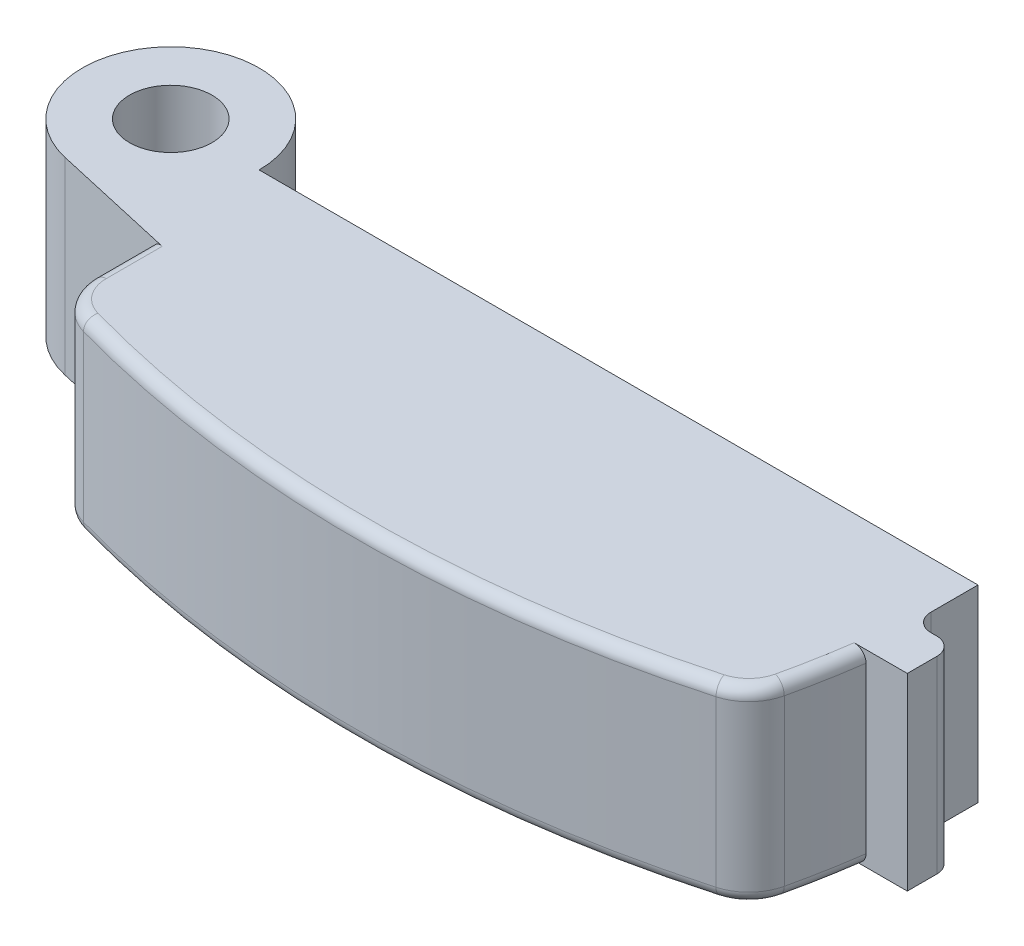
ISO-10303-21;
HEADER;
FILE_DESCRIPTION(('STEP AP214'),'2;1');
FILE_NAME('part.step','',(''),(''),'','','');
FILE_SCHEMA(('AUTOMOTIVE_DESIGN { 1 0 10303 214 1 1 1 1 }'));
ENDSEC;
DATA;
#1=APPLICATION_CONTEXT('core data for automotive mechanical design processes');
#2=APPLICATION_PROTOCOL_DEFINITION('international standard','automotive_design',2000,#1);
#3=PRODUCT_CONTEXT('',#1,'mechanical');
#4=PRODUCT('Part','Part','',(#3));
#5=PRODUCT_RELATED_PRODUCT_CATEGORY('part','',(#4));
#6=PRODUCT_DEFINITION_FORMATION('','',#4);
#7=PRODUCT_DEFINITION_CONTEXT('part definition',#1,'design');
#8=PRODUCT_DEFINITION('design','',#6,#7);
#9=PRODUCT_DEFINITION_SHAPE('','',#8);
#10=(LENGTH_UNIT() NAMED_UNIT(*) SI_UNIT(.MILLI.,.METRE.));
#11=(NAMED_UNIT(*) PLANE_ANGLE_UNIT() SI_UNIT($,.RADIAN.));
#12=(NAMED_UNIT(*) SI_UNIT($,.STERADIAN.) SOLID_ANGLE_UNIT());
#13=UNCERTAINTY_MEASURE_WITH_UNIT(LENGTH_MEASURE(1.E-05),#10,'distance_accuracy_value','');
#14=(GEOMETRIC_REPRESENTATION_CONTEXT(3) GLOBAL_UNCERTAINTY_ASSIGNED_CONTEXT((#13)) GLOBAL_UNIT_ASSIGNED_CONTEXT((#10,
#11,#12)) REPRESENTATION_CONTEXT('',''));
#15=CARTESIAN_POINT('',(0.,0.,0.));
#16=DIRECTION('',(0.,0.,1.));
#17=DIRECTION('',(1.,0.,0.));
#18=AXIS2_PLACEMENT_3D('',#15,#16,#17);
#19=CARTESIAN_POINT('',(34.25,-4.,0.));
#20=DIRECTION('',(1.,0.,0.));
#21=DIRECTION('',(0.,0.,-1.));
#22=AXIS2_PLACEMENT_3D('',#19,#20,#21);
#23=PLANE('',#22);
#24=DIRECTION('',(0.,0.,-1.));
#25=VECTOR('',#24,1.);
#26=CARTESIAN_POINT('',(34.25,4.,0.));
#27=LINE('',#26,#25);
#28=CARTESIAN_POINT('',(34.25,4.,2.));
#29=VERTEX_POINT('',#28);
#30=CARTESIAN_POINT('',(34.25,4.,0.));
#31=VERTEX_POINT('',#30);
#32=EDGE_CURVE('E262',#29,#31,#27,.T.);
#33=ORIENTED_EDGE('',*,*,#32,.F.);
#34=DIRECTION('',(0.,-1.,0.));
#35=VECTOR('',#34,1.);
#36=CARTESIAN_POINT('',(34.25,-4.,2.));
#37=LINE('',#36,#35);
#38=CARTESIAN_POINT('',(34.25,-4.,2.));
#39=VERTEX_POINT('',#38);
#40=EDGE_CURVE('E389',#29,#39,#37,.T.);
#41=ORIENTED_EDGE('',*,*,#40,.T.);
#42=DIRECTION('',(0.,0.,-1.));
#43=VECTOR('',#42,1.);
#44=CARTESIAN_POINT('',(34.25,-4.,0.));
#45=LINE('',#44,#43);
#46=CARTESIAN_POINT('',(34.25,-4.,0.));
#47=VERTEX_POINT('',#46);
#48=EDGE_CURVE('E265',#39,#47,#45,.T.);
#49=ORIENTED_EDGE('',*,*,#48,.T.);
#50=DIRECTION('',(0.,1.,0.));
#51=VECTOR('',#50,1.);
#52=CARTESIAN_POINT('',(34.25,-4.,0.));
#53=LINE('',#52,#51);
#54=EDGE_CURVE('E276',#47,#31,#53,.T.);
#55=ORIENTED_EDGE('',*,*,#54,.T.);
#56=EDGE_LOOP('',(#33,#41,#49,#55));
#57=FACE_BOUND('',#56,.T.);
#58=ADVANCED_FACE('F35',(#57),#23,.T.);
#59=CARTESIAN_POINT('',(0.,-4.,0.));
#60=DIRECTION('',(0.,1.,0.));
#61=DIRECTION('',(0.,0.,1.));
#62=AXIS2_PLACEMENT_3D('',#59,#60,#61);
#63=CYLINDRICAL_SURFACE('',#62,34.5778108040402);
#64=DIRECTION('',(0.,1.,0.));
#65=VECTOR('',#64,1.);
#66=CARTESIAN_POINT('',(34.25,-4.,4.75));
#67=LINE('',#66,#65);
#68=CARTESIAN_POINT('',(34.25,-3.5,4.75));
#69=VERTEX_POINT('',#68);
#70=CARTESIAN_POINT('',(34.25,3.5,4.75));
#71=VERTEX_POINT('',#70);
#72=EDGE_CURVE('E285',#69,#71,#67,.T.);
#73=ORIENTED_EDGE('',*,*,#72,.T.);
#74=CARTESIAN_POINT('',(0.,3.5,0.));
#75=DIRECTION('',(0.,-1.,0.));
#76=DIRECTION('',(0.,0.,-1.));
#77=AXIS2_PLACEMENT_3D('',#74,#75,#76);
#78=CIRCLE('',#77,34.5778108040402);
#79=CARTESIAN_POINT('',(33.7133062471766,3.5,7.68361776014925));
#80=VERTEX_POINT('',#79);
#81=EDGE_CURVE('E332',#71,#80,#78,.T.);
#82=ORIENTED_EDGE('',*,*,#81,.T.);
#83=DIRECTION('',(0.,1.,0.));
#84=VECTOR('',#83,1.);
#85=CARTESIAN_POINT('',(33.7133062471766,-4.,7.68361776014925));
#86=LINE('',#85,#84);
#87=CARTESIAN_POINT('',(33.7133062471766,-3.5,7.68361776014925));
#88=VERTEX_POINT('',#87);
#89=EDGE_CURVE('E289',#88,#80,#86,.T.);
#90=ORIENTED_EDGE('',*,*,#89,.F.);
#91=CARTESIAN_POINT('',(0.,-3.5,0.));
#92=DIRECTION('',(0.,-1.,0.));
#93=DIRECTION('',(0.,0.,-1.));
#94=AXIS2_PLACEMENT_3D('',#91,#92,#93);
#95=CIRCLE('',#94,34.5778108040402);
#96=EDGE_CURVE('E330',#88,#69,#95,.F.);
#97=ORIENTED_EDGE('',*,*,#96,.T.);
#98=EDGE_LOOP('',(#73,#82,#90,#97));
#99=FACE_BOUND('',#98,.T.);
#100=ADVANCED_FACE('F410',(#99),#63,.T.);
#101=CARTESIAN_POINT('',(31.7633096763563,-4.,7.23919299285014));
#102=DIRECTION('',(0.,1.,0.));
#103=DIRECTION('',(0.,0.,1.));
#104=AXIS2_PLACEMENT_3D('',#101,#102,#103);
#105=CYLINDRICAL_SURFACE('',#104,2.);
#106=ORIENTED_EDGE('',*,*,#89,.T.);
#107=CARTESIAN_POINT('',(31.7633096763563,3.5,7.23919299285014));
#108=DIRECTION('',(0.,-1.,0.));
#109=DIRECTION('',(0.,0.,-1.));
#110=AXIS2_PLACEMENT_3D('',#107,#108,#109);
#111=CIRCLE('',#110,2.);
#112=CARTESIAN_POINT('',(32.3000452946137,3.5,9.1658260342189));
#113=VERTEX_POINT('',#112);
#114=EDGE_CURVE('E336',#80,#113,#111,.T.);
#115=ORIENTED_EDGE('',*,*,#114,.T.);
#116=DIRECTION('',(0.,1.,0.));
#117=VECTOR('',#116,1.);
#118=CARTESIAN_POINT('',(32.3000452946137,-4.,9.1658260342189));
#119=LINE('',#118,#117);
#120=CARTESIAN_POINT('',(32.3000452946137,-3.5,9.1658260342189));
#121=VERTEX_POINT('',#120);
#122=EDGE_CURVE('E292',#121,#113,#119,.T.);
#123=ORIENTED_EDGE('',*,*,#122,.F.);
#124=CARTESIAN_POINT('',(31.7633096763563,-3.5,7.23919299285014));
#125=DIRECTION('',(0.,-1.,0.));
#126=DIRECTION('',(0.,0.,-1.));
#127=AXIS2_PLACEMENT_3D('',#124,#125,#126);
#128=CIRCLE('',#127,2.);
#129=EDGE_CURVE('E334',#121,#88,#128,.F.);
#130=ORIENTED_EDGE('',*,*,#129,.T.);
#131=EDGE_LOOP('',(#106,#115,#123,#130));
#132=FACE_BOUND('',#131,.T.);
#133=ADVANCED_FACE('F416',(#132),#105,.T.);
#134=CARTESIAN_POINT('',(18.8816548381781,-4.,-39.));
#135=DIRECTION('',(0.,1.,0.));
#136=DIRECTION('',(0.,0.,1.));
#137=AXIS2_PLACEMENT_3D('',#134,#135,#136);
#138=CYLINDRICAL_SURFACE('',#137,50.);
#139=ORIENTED_EDGE('',*,*,#122,.T.);
#140=CARTESIAN_POINT('',(18.8816548381781,3.5,-39.));
#141=DIRECTION('',(0.,-1.,0.));
#142=DIRECTION('',(0.,0.,-1.));
#143=AXIS2_PLACEMENT_3D('',#140,#141,#142);
#144=CIRCLE('',#143,50.);
#145=CARTESIAN_POINT('',(5.46326438174258,3.5,9.16582603421889));
#146=VERTEX_POINT('',#145);
#147=EDGE_CURVE('E351',#113,#146,#144,.T.);
#148=ORIENTED_EDGE('',*,*,#147,.T.);
#149=DIRECTION('',(0.,1.,0.));
#150=VECTOR('',#149,1.);
#151=CARTESIAN_POINT('',(5.46326438174258,-4.,9.16582603421889));
#152=LINE('',#151,#150);
#153=CARTESIAN_POINT('',(5.46326438174258,-3.5,9.16582603421889));
#154=VERTEX_POINT('',#153);
#155=EDGE_CURVE('E295',#154,#146,#152,.T.);
#156=ORIENTED_EDGE('',*,*,#155,.F.);
#157=CARTESIAN_POINT('',(18.8816548381781,-3.5,-39.));
#158=DIRECTION('',(0.,-1.,0.));
#159=DIRECTION('',(0.,0.,-1.));
#160=AXIS2_PLACEMENT_3D('',#157,#158,#159);
#161=CIRCLE('',#160,50.);
#162=EDGE_CURVE('E349',#154,#121,#161,.F.);
#163=ORIENTED_EDGE('',*,*,#162,.T.);
#164=EDGE_LOOP('',(#139,#148,#156,#163));
#165=FACE_BOUND('',#164,.T.);
#166=ADVANCED_FACE('F526',(#165),#138,.T.);
#167=CARTESIAN_POINT('',(6.,-4.,7.23919299285014));
#168=DIRECTION('',(0.,1.,0.));
#169=DIRECTION('',(0.,0.,1.));
#170=AXIS2_PLACEMENT_3D('',#167,#168,#169);
#171=CYLINDRICAL_SURFACE('',#170,2.);
#172=ORIENTED_EDGE('',*,*,#155,.T.);
#173=CARTESIAN_POINT('',(6.,3.5,7.23919299285014));
#174=DIRECTION('',(0.,-1.,0.));
#175=DIRECTION('',(0.,0.,-1.));
#176=AXIS2_PLACEMENT_3D('',#173,#174,#175);
#177=CIRCLE('',#176,2.);
#178=CARTESIAN_POINT('',(4.,3.5,7.23919299285014));
#179=VERTEX_POINT('',#178);
#180=EDGE_CURVE('E328',#146,#179,#177,.T.);
#181=ORIENTED_EDGE('',*,*,#180,.T.);
#182=DIRECTION('',(0.,1.,0.));
#183=VECTOR('',#182,1.);
#184=CARTESIAN_POINT('',(4.,-4.,7.23919299285014));
#185=LINE('',#184,#183);
#186=CARTESIAN_POINT('',(4.,-3.5,7.23919299285014));
#187=VERTEX_POINT('',#186);
#188=EDGE_CURVE('E298',#187,#179,#185,.T.);
#189=ORIENTED_EDGE('',*,*,#188,.F.);
#190=CARTESIAN_POINT('',(6.,-3.5,7.23919299285014));
#191=DIRECTION('',(0.,-1.,0.));
#192=DIRECTION('',(0.,0.,-1.));
#193=AXIS2_PLACEMENT_3D('',#190,#191,#192);
#194=CIRCLE('',#193,2.);
#195=EDGE_CURVE('E326',#187,#154,#194,.F.);
#196=ORIENTED_EDGE('',*,*,#195,.T.);
#197=EDGE_LOOP('',(#172,#181,#189,#196));
#198=FACE_BOUND('',#197,.T.);
#199=ADVANCED_FACE('F509',(#198),#171,.T.);
#200=CARTESIAN_POINT('',(4.,-4.,7.23919299285014));
#201=DIRECTION('',(-1.,0.,0.));
#202=DIRECTION('',(0.,0.,1.));
#203=AXIS2_PLACEMENT_3D('',#200,#201,#202);
#204=PLANE('',#203);
#205=ORIENTED_EDGE('',*,*,#188,.T.);
#206=DIRECTION('',(0.,0.,1.));
#207=VECTOR('',#206,1.);
#208=CARTESIAN_POINT('',(4.,3.5,4.75));
#209=LINE('',#208,#207);
#210=CARTESIAN_POINT('',(4.,3.5,4.75));
#211=VERTEX_POINT('',#210);
#212=EDGE_CURVE('E324',#179,#211,#209,.F.);
#213=ORIENTED_EDGE('',*,*,#212,.T.);
#214=DIRECTION('',(0.,1.,0.));
#215=VECTOR('',#214,1.);
#216=CARTESIAN_POINT('',(4.,-4.,4.75));
#217=LINE('',#216,#215);
#218=CARTESIAN_POINT('',(4.,-3.5,4.75));
#219=VERTEX_POINT('',#218);
#220=EDGE_CURVE('E301',#219,#211,#217,.T.);
#221=ORIENTED_EDGE('',*,*,#220,.F.);
#222=DIRECTION('',(0.,0.,1.));
#223=VECTOR('',#222,1.);
#224=CARTESIAN_POINT('',(4.,-3.5,7.23919299285014));
#225=LINE('',#224,#223);
#226=EDGE_CURVE('E321',#219,#187,#225,.T.);
#227=ORIENTED_EDGE('',*,*,#226,.T.);
#228=EDGE_LOOP('',(#205,#213,#221,#227));
#229=FACE_BOUND('',#228,.T.);
#230=ADVANCED_FACE('F512',(#229),#204,.T.);
#231=CARTESIAN_POINT('',(-0.827679138520523,-4.,3.6575192745436));
#232=DIRECTION('',(-0.220714436938806,0.,0.975338473211626));
#233=DIRECTION('',(0.975338473211626,0.,0.220714436938806));
#234=AXIS2_PLACEMENT_3D('',#231,#232,#233);
#235=PLANE('',#234);
#236=DIRECTION('',(0.975338473211626,0.,0.220714436938806));
#237=VECTOR('',#236,1.);
#238=CARTESIAN_POINT('',(-0.827679138520523,4.,3.6575192745436));
#239=LINE('',#238,#237);
#240=CARTESIAN_POINT('',(-0.827679138520524,4.,3.6575192745436));
#241=VERTEX_POINT('',#240);
#242=CARTESIAN_POINT('',(4.5,4.,4.86314761131694));
#243=VERTEX_POINT('',#242);
#244=EDGE_CURVE('E268',#241,#243,#239,.T.);
#245=ORIENTED_EDGE('',*,*,#244,.F.);
#246=DIRECTION('',(0.,1.,0.));
#247=VECTOR('',#246,1.);
#248=CARTESIAN_POINT('',(-0.827679138520524,-4.,3.6575192745436));
#249=LINE('',#248,#247);
#250=CARTESIAN_POINT('',(-0.827679138520524,-4.,3.6575192745436));
#251=VERTEX_POINT('',#250);
#252=EDGE_CURVE('E304',#251,#241,#249,.T.);
#253=ORIENTED_EDGE('',*,*,#252,.F.);
#254=DIRECTION('',(0.975338473211626,0.,0.220714436938806));
#255=VECTOR('',#254,1.);
#256=CARTESIAN_POINT('',(-0.827679138520523,-4.,3.6575192745436));
#257=LINE('',#256,#255);
#258=CARTESIAN_POINT('',(4.5,-4.,4.86314761131694));
#259=VERTEX_POINT('',#258);
#260=EDGE_CURVE('E274',#251,#259,#257,.T.);
#261=ORIENTED_EDGE('',*,*,#260,.T.);
#262=CARTESIAN_POINT('',(4.5,-3.5,4.86314761131694));
#263=DIRECTION('',(-0.220714436938806,0.,0.975338473211626));
#264=DIRECTION('',(0.975338473211626,0.,0.220714436938806));
#265=AXIS2_PLACEMENT_3D('',#262,#263,#264);
#266=ELLIPSE('',#265,0.512642547928601,0.5);
#267=EDGE_CURVE('E364',#259,#219,#266,.F.);
#268=ORIENTED_EDGE('',*,*,#267,.T.);
#269=ORIENTED_EDGE('',*,*,#220,.T.);
#270=CARTESIAN_POINT('',(4.5,3.5,4.86314761131694));
#271=DIRECTION('',(-0.220714436938806,0.,0.975338473211626));
#272=DIRECTION('',(-0.975338473211626,0.,-0.220714436938806));
#273=AXIS2_PLACEMENT_3D('',#270,#271,#272);
#274=ELLIPSE('',#273,0.512642547928601,0.5);
#275=EDGE_CURVE('E353',#211,#243,#274,.F.);
#276=ORIENTED_EDGE('',*,*,#275,.T.);
#277=EDGE_LOOP('',(#245,#253,#261,#268,#269,#276));
#278=FACE_BOUND('',#277,.T.);
#279=ADVANCED_FACE('F495',(#278),#235,.T.);
#280=CARTESIAN_POINT('',(0.,-4.,0.));
#281=DIRECTION('',(0.,1.,0.));
#282=DIRECTION('',(0.,0.,1.));
#283=AXIS2_PLACEMENT_3D('',#280,#281,#282);
#284=CYLINDRICAL_SURFACE('',#283,3.75);
#285=CARTESIAN_POINT('',(0.,4.,0.));
#286=DIRECTION('',(0.,1.,0.));
#287=DIRECTION('',(0.,0.,1.));
#288=AXIS2_PLACEMENT_3D('',#285,#286,#287);
#289=CIRCLE('',#288,3.75);
#290=CARTESIAN_POINT('',(3.75,4.,0.));
#291=VERTEX_POINT('',#290);
#292=EDGE_CURVE('E281',#291,#241,#289,.T.);
#293=ORIENTED_EDGE('',*,*,#292,.F.);
#294=DIRECTION('',(0.,1.,0.));
#295=VECTOR('',#294,1.);
#296=CARTESIAN_POINT('',(3.75,-4.,0.));
#297=LINE('',#296,#295);
#298=CARTESIAN_POINT('',(3.75,-4.,0.));
#299=VERTEX_POINT('',#298);
#300=EDGE_CURVE('E306',#299,#291,#297,.T.);
#301=ORIENTED_EDGE('',*,*,#300,.F.);
#302=CARTESIAN_POINT('',(0.,-4.,0.));
#303=DIRECTION('',(0.,1.,0.));
#304=DIRECTION('',(0.,0.,1.));
#305=AXIS2_PLACEMENT_3D('',#302,#303,#304);
#306=CIRCLE('',#305,3.75);
#307=EDGE_CURVE('E271',#299,#251,#306,.T.);
#308=ORIENTED_EDGE('',*,*,#307,.T.);
#309=ORIENTED_EDGE('',*,*,#252,.T.);
#310=EDGE_LOOP('',(#293,#301,#308,#309));
#311=FACE_BOUND('',#310,.T.);
#312=ADVANCED_FACE('F491',(#311),#284,.T.);
#313=CARTESIAN_POINT('',(3.75,-4.,0.));
#314=DIRECTION('',(0.,0.,-1.));
#315=DIRECTION('',(-1.,0.,0.));
#316=AXIS2_PLACEMENT_3D('',#313,#314,#315);
#317=PLANE('',#316);
#318=DIRECTION('',(0.,1.,0.));
#319=VECTOR('',#318,1.);
#320=CARTESIAN_POINT('',(28.,2.5,0.));
#321=LINE('',#320,#319);
#322=CARTESIAN_POINT('',(28.,-2.5,0.));
#323=VERTEX_POINT('',#322);
#324=CARTESIAN_POINT('',(28.,2.5,0.));
#325=VERTEX_POINT('',#324);
#326=EDGE_CURVE('E204',#323,#325,#321,.T.);
#327=ORIENTED_EDGE('',*,*,#326,.F.);
#328=DIRECTION('',(-1.,0.,0.));
#329=VECTOR('',#328,1.);
#330=CARTESIAN_POINT('',(32.,-2.5,0.));
#331=LINE('',#330,#329);
#332=CARTESIAN_POINT('',(32.,-2.5,0.));
#333=VERTEX_POINT('',#332);
#334=EDGE_CURVE('E221',#333,#323,#331,.T.);
#335=ORIENTED_EDGE('',*,*,#334,.F.);
#336=DIRECTION('',(0.,-1.,0.));
#337=VECTOR('',#336,1.);
#338=CARTESIAN_POINT('',(32.,2.5,0.));
#339=LINE('',#338,#337);
#340=CARTESIAN_POINT('',(32.,2.5,0.));
#341=VERTEX_POINT('',#340);
#342=EDGE_CURVE('E224',#341,#333,#339,.T.);
#343=ORIENTED_EDGE('',*,*,#342,.F.);
#344=DIRECTION('',(1.,0.,0.));
#345=VECTOR('',#344,1.);
#346=CARTESIAN_POINT('',(32.,2.5,0.));
#347=LINE('',#346,#345);
#348=EDGE_CURVE('E230',#325,#341,#347,.T.);
#349=ORIENTED_EDGE('',*,*,#348,.F.);
#350=EDGE_LOOP('',(#327,#335,#343,#349));
#351=FACE_BOUND('',#350,.T.);
#352=DIRECTION('',(-1.,0.,0.));
#353=VECTOR('',#352,1.);
#354=CARTESIAN_POINT('',(3.75,4.,0.));
#355=LINE('',#354,#353);
#356=EDGE_CURVE('E278',#31,#291,#355,.T.);
#357=ORIENTED_EDGE('',*,*,#356,.F.);
#358=ORIENTED_EDGE('',*,*,#54,.F.);
#359=DIRECTION('',(-1.,0.,0.));
#360=VECTOR('',#359,1.);
#361=CARTESIAN_POINT('',(3.75,-4.,0.));
#362=LINE('',#361,#360);
#363=EDGE_CURVE('E267',#47,#299,#362,.T.);
#364=ORIENTED_EDGE('',*,*,#363,.T.);
#365=ORIENTED_EDGE('',*,*,#300,.T.);
#366=EDGE_LOOP('',(#357,#358,#364,#365));
#367=FACE_BOUND('',#366,.T.);
#368=ADVANCED_FACE('F422',(#351,#367),#317,.T.);
#369=CARTESIAN_POINT('',(0.,-4.,0.));
#370=DIRECTION('',(0.,-1.,0.));
#371=DIRECTION('',(0.,0.,-1.));
#372=AXIS2_PLACEMENT_3D('',#369,#370,#371);
#373=PLANE('',#372);
#374=CARTESIAN_POINT('',(0.,-4.,0.));
#375=DIRECTION('',(0.,1.,0.));
#376=DIRECTION('',(0.,0.,1.));
#377=AXIS2_PLACEMENT_3D('',#374,#375,#376);
#378=CIRCLE('',#377,1.75);
#379=CARTESIAN_POINT('',(0.,-4.,1.75));
#380=VERTEX_POINT('',#379);
#381=EDGE_CURVE('E259',#380,#380,#378,.T.);
#382=ORIENTED_EDGE('',*,*,#381,.T.);
#383=EDGE_LOOP('',(#382));
#384=FACE_BOUND('',#383,.T.);
#385=DIRECTION('',(1.,0.,0.));
#386=VECTOR('',#385,1.);
#387=CARTESIAN_POINT('',(34.25,-4.,2.75));
#388=LINE('',#387,#386);
#389=CARTESIAN_POINT('',(35.,-4.,2.75));
#390=VERTEX_POINT('',#389);
#391=CARTESIAN_POINT('',(35.25,-4.,2.75));
#392=VERTEX_POINT('',#391);
#393=EDGE_CURVE('E240',#390,#392,#388,.T.);
#394=ORIENTED_EDGE('',*,*,#393,.T.);
#395=CARTESIAN_POINT('',(35.25,-4.,3.5));
#396=DIRECTION('',(0.,-1.,0.));
#397=DIRECTION('',(0.,0.,-1.));
#398=AXIS2_PLACEMENT_3D('',#395,#396,#397);
#399=CIRCLE('',#398,0.75);
#400=CARTESIAN_POINT('',(36.,-4.,3.5));
#401=VERTEX_POINT('',#400);
#402=EDGE_CURVE('E58',#392,#401,#399,.T.);
#403=ORIENTED_EDGE('',*,*,#402,.T.);
#404=DIRECTION('',(0.,0.,1.));
#405=VECTOR('',#404,1.);
#406=CARTESIAN_POINT('',(36.,-4.,2.75));
#407=LINE('',#406,#405);
#408=CARTESIAN_POINT('',(36.,-4.,4.75));
#409=VERTEX_POINT('',#408);
#410=EDGE_CURVE('E246',#401,#409,#407,.T.);
#411=ORIENTED_EDGE('',*,*,#410,.T.);
#412=DIRECTION('',(1.,0.,0.));
#413=VECTOR('',#412,1.);
#414=CARTESIAN_POINT('',(34.25,-4.,4.75));
#415=LINE('',#414,#413);
#416=CARTESIAN_POINT('',(33.7451431941837,-4.,4.74999999999999));
#417=VERTEX_POINT('',#416);
#418=EDGE_CURVE('E247',#417,#409,#415,.T.);
#419=ORIENTED_EDGE('',*,*,#418,.F.);
#420=CARTESIAN_POINT('',(0.,-4.,0.));
#421=DIRECTION('',(0.,-1.,0.));
#422=DIRECTION('',(0.,0.,-1.));
#423=AXIS2_PLACEMENT_3D('',#420,#421,#422);
#424=CIRCLE('',#423,34.0778108040402);
#425=CARTESIAN_POINT('',(33.2258071044715,-4.,7.57251156832448));
#426=VERTEX_POINT('',#425);
#427=EDGE_CURVE('E342',#417,#426,#424,.T.);
#428=ORIENTED_EDGE('',*,*,#427,.T.);
#429=CARTESIAN_POINT('',(31.7633096763563,-4.,7.23919299285014));
#430=DIRECTION('',(0.,-1.,0.));
#431=DIRECTION('',(0.,0.,-1.));
#432=AXIS2_PLACEMENT_3D('',#429,#430,#431);
#433=CIRCLE('',#432,1.5);
#434=CARTESIAN_POINT('',(32.1658613900494,-4.,8.68416777387671));
#435=VERTEX_POINT('',#434);
#436=EDGE_CURVE('E340',#426,#435,#433,.T.);
#437=ORIENTED_EDGE('',*,*,#436,.T.);
#438=CARTESIAN_POINT('',(18.8816548381781,-4.,-39.));
#439=DIRECTION('',(0.,-1.,0.));
#440=DIRECTION('',(0.,0.,-1.));
#441=AXIS2_PLACEMENT_3D('',#438,#439,#440);
#442=CIRCLE('',#441,49.5);
#443=CARTESIAN_POINT('',(5.59744828630693,-4.,8.68416777387671));
#444=VERTEX_POINT('',#443);
#445=EDGE_CURVE('E338',#435,#444,#442,.T.);
#446=ORIENTED_EDGE('',*,*,#445,.T.);
#447=CARTESIAN_POINT('',(6.,-4.,7.23919299285014));
#448=DIRECTION('',(0.,-1.,0.));
#449=DIRECTION('',(0.,0.,-1.));
#450=AXIS2_PLACEMENT_3D('',#447,#448,#449);
#451=CIRCLE('',#450,1.5);
#452=CARTESIAN_POINT('',(4.5,-4.,7.23919299285014));
#453=VERTEX_POINT('',#452);
#454=EDGE_CURVE('E344',#444,#453,#451,.T.);
#455=ORIENTED_EDGE('',*,*,#454,.T.);
#456=DIRECTION('',(0.,0.,1.));
#457=VECTOR('',#456,1.);
#458=CARTESIAN_POINT('',(4.5,-4.,0.));
#459=LINE('',#458,#457);
#460=EDGE_CURVE('E346',#453,#259,#459,.F.);
#461=ORIENTED_EDGE('',*,*,#460,.T.);
#462=ORIENTED_EDGE('',*,*,#260,.F.);
#463=ORIENTED_EDGE('',*,*,#307,.F.);
#464=ORIENTED_EDGE('',*,*,#363,.F.);
#465=ORIENTED_EDGE('',*,*,#48,.F.);
#466=CARTESIAN_POINT('',(35.,-4.,2.));
#467=DIRECTION('',(0.,-1.,0.));
#468=DIRECTION('',(0.,0.,-1.));
#469=AXIS2_PLACEMENT_3D('',#466,#467,#468);
#470=CIRCLE('',#469,0.75);
#471=EDGE_CURVE('E43',#39,#390,#470,.F.);
#472=ORIENTED_EDGE('',*,*,#471,.T.);
#473=EDGE_LOOP('',(#394,#403,#411,#419,#428,#437,#446,#455,#461,#462,#463,#464,#465,#472));
#474=FACE_BOUND('',#473,.T.);
#475=ADVANCED_FACE('F475',(#384,#474),#373,.T.);
#476=CARTESIAN_POINT('',(0.,4.,0.));
#477=DIRECTION('',(0.,-1.,0.));
#478=DIRECTION('',(0.,0.,-1.));
#479=AXIS2_PLACEMENT_3D('',#476,#477,#478);
#480=PLANE('',#479);
#481=DIRECTION('',(0.,0.,1.));
#482=VECTOR('',#481,1.);
#483=CARTESIAN_POINT('',(36.,4.,2.75));
#484=LINE('',#483,#482);
#485=CARTESIAN_POINT('',(36.,4.,3.5));
#486=VERTEX_POINT('',#485);
#487=CARTESIAN_POINT('',(36.,4.,4.75));
#488=VERTEX_POINT('',#487);
#489=EDGE_CURVE('E255',#486,#488,#484,.T.);
#490=ORIENTED_EDGE('',*,*,#489,.F.);
#491=CARTESIAN_POINT('',(35.25,4.,3.5));
#492=DIRECTION('',(0.,-1.,0.));
#493=DIRECTION('',(0.,0.,-1.));
#494=AXIS2_PLACEMENT_3D('',#491,#492,#493);
#495=CIRCLE('',#494,0.75);
#496=CARTESIAN_POINT('',(35.25,4.,2.75));
#497=VERTEX_POINT('',#496);
#498=EDGE_CURVE('E50',#486,#497,#495,.F.);
#499=ORIENTED_EDGE('',*,*,#498,.T.);
#500=DIRECTION('',(-1.,0.,0.));
#501=VECTOR('',#500,1.);
#502=CARTESIAN_POINT('',(36.,4.,2.75));
#503=LINE('',#502,#501);
#504=CARTESIAN_POINT('',(35.,4.,2.75));
#505=VERTEX_POINT('',#504);
#506=EDGE_CURVE('E242',#497,#505,#503,.T.);
#507=ORIENTED_EDGE('',*,*,#506,.T.);
#508=CARTESIAN_POINT('',(35.,4.,2.));
#509=DIRECTION('',(0.,-1.,0.));
#510=DIRECTION('',(0.,0.,-1.));
#511=AXIS2_PLACEMENT_3D('',#508,#509,#510);
#512=CIRCLE('',#511,0.75);
#513=EDGE_CURVE('E11',#505,#29,#512,.T.);
#514=ORIENTED_EDGE('',*,*,#513,.T.);
#515=ORIENTED_EDGE('',*,*,#32,.T.);
#516=ORIENTED_EDGE('',*,*,#356,.T.);
#517=ORIENTED_EDGE('',*,*,#292,.T.);
#518=ORIENTED_EDGE('',*,*,#244,.T.);
#519=DIRECTION('',(0.,0.,1.));
#520=VECTOR('',#519,1.);
#521=CARTESIAN_POINT('',(4.5,4.,7.23919299285014));
#522=LINE('',#521,#520);
#523=CARTESIAN_POINT('',(4.5,4.,7.23919299285014));
#524=VERTEX_POINT('',#523);
#525=EDGE_CURVE('E318',#243,#524,#522,.T.);
#526=ORIENTED_EDGE('',*,*,#525,.T.);
#527=CARTESIAN_POINT('',(6.,4.,7.23919299285014));
#528=DIRECTION('',(0.,-1.,0.));
#529=DIRECTION('',(0.,0.,-1.));
#530=AXIS2_PLACEMENT_3D('',#527,#528,#529);
#531=CIRCLE('',#530,1.5);
#532=CARTESIAN_POINT('',(5.59744828630693,4.,8.68416777387671));
#533=VERTEX_POINT('',#532);
#534=EDGE_CURVE('E316',#524,#533,#531,.F.);
#535=ORIENTED_EDGE('',*,*,#534,.T.);
#536=CARTESIAN_POINT('',(18.8816548381781,4.,-39.));
#537=DIRECTION('',(0.,-1.,0.));
#538=DIRECTION('',(0.,0.,-1.));
#539=AXIS2_PLACEMENT_3D('',#536,#537,#538);
#540=CIRCLE('',#539,49.5);
#541=CARTESIAN_POINT('',(32.1658613900494,4.,8.68416777387671));
#542=VERTEX_POINT('',#541);
#543=EDGE_CURVE('E288',#533,#542,#540,.F.);
#544=ORIENTED_EDGE('',*,*,#543,.T.);
#545=CARTESIAN_POINT('',(31.7633096763563,4.,7.23919299285014));
#546=DIRECTION('',(0.,-1.,0.));
#547=DIRECTION('',(0.,0.,-1.));
#548=AXIS2_PLACEMENT_3D('',#545,#546,#547);
#549=CIRCLE('',#548,1.5);
#550=CARTESIAN_POINT('',(33.2258071044715,4.,7.57251156832448));
#551=VERTEX_POINT('',#550);
#552=EDGE_CURVE('E311',#542,#551,#549,.F.);
#553=ORIENTED_EDGE('',*,*,#552,.T.);
#554=CARTESIAN_POINT('',(0.,4.,0.));
#555=DIRECTION('',(0.,-1.,0.));
#556=DIRECTION('',(0.,0.,-1.));
#557=AXIS2_PLACEMENT_3D('',#554,#555,#556);
#558=CIRCLE('',#557,34.0778108040402);
#559=CARTESIAN_POINT('',(33.7451431941837,4.,4.74999999999999));
#560=VERTEX_POINT('',#559);
#561=EDGE_CURVE('E313',#551,#560,#558,.F.);
#562=ORIENTED_EDGE('',*,*,#561,.T.);
#563=DIRECTION('',(-1.,0.,0.));
#564=VECTOR('',#563,1.);
#565=CARTESIAN_POINT('',(36.,4.,4.75));
#566=LINE('',#565,#564);
#567=EDGE_CURVE('E243',#488,#560,#566,.T.);
#568=ORIENTED_EDGE('',*,*,#567,.F.);
#569=EDGE_LOOP('',(#490,#499,#507,#514,#515,#516,#517,#518,#526,#535,#544,#553,#562,#568));
#570=FACE_BOUND('',#569,.T.);
#571=CARTESIAN_POINT('',(0.,4.,0.));
#572=DIRECTION('',(0.,1.,0.));
#573=DIRECTION('',(0.,0.,1.));
#574=AXIS2_PLACEMENT_3D('',#571,#572,#573);
#575=CIRCLE('',#574,1.75);
#576=CARTESIAN_POINT('',(0.,4.,1.75));
#577=VERTEX_POINT('',#576);
#578=EDGE_CURVE('E257',#577,#577,#575,.T.);
#579=ORIENTED_EDGE('',*,*,#578,.F.);
#580=EDGE_LOOP('',(#579));
#581=FACE_BOUND('',#580,.T.);
#582=ADVANCED_FACE('F483',(#570,#581),#480,.F.);
#583=CARTESIAN_POINT('',(0.,-4.,0.));
#584=DIRECTION('',(0.,1.,0.));
#585=DIRECTION('',(0.,0.,1.));
#586=AXIS2_PLACEMENT_3D('',#583,#584,#585);
#587=CYLINDRICAL_SURFACE('',#586,1.75);
#588=ORIENTED_EDGE('',*,*,#381,.F.);
#589=EDGE_LOOP('',(#588));
#590=FACE_BOUND('',#589,.T.);
#591=ORIENTED_EDGE('',*,*,#578,.T.);
#592=EDGE_LOOP('',(#591));
#593=FACE_BOUND('',#592,.T.);
#594=ADVANCED_FACE('F547',(#590,#593),#587,.F.);
#595=CARTESIAN_POINT('',(36.,-4.,2.75));
#596=DIRECTION('',(1.,0.,0.));
#597=DIRECTION('',(0.,0.,-1.));
#598=AXIS2_PLACEMENT_3D('',#595,#596,#597);
#599=PLANE('',#598);
#600=ORIENTED_EDGE('',*,*,#410,.F.);
#601=DIRECTION('',(0.,1.,0.));
#602=VECTOR('',#601,1.);
#603=CARTESIAN_POINT('',(36.,4.,3.5));
#604=LINE('',#603,#602);
#605=EDGE_CURVE('E470',#401,#486,#604,.T.);
#606=ORIENTED_EDGE('',*,*,#605,.T.);
#607=ORIENTED_EDGE('',*,*,#489,.T.);
#608=DIRECTION('',(0.,1.,0.));
#609=VECTOR('',#608,1.);
#610=CARTESIAN_POINT('',(36.,-4.,4.75));
#611=LINE('',#610,#609);
#612=EDGE_CURVE('E250',#409,#488,#611,.T.);
#613=ORIENTED_EDGE('',*,*,#612,.F.);
#614=EDGE_LOOP('',(#600,#606,#607,#613));
#615=FACE_BOUND('',#614,.T.);
#616=ADVANCED_FACE('F378',(#615),#599,.T.);
#617=CARTESIAN_POINT('',(0.,0.,2.75));
#618=DIRECTION('',(0.,0.,1.));
#619=DIRECTION('',(1.,0.,0.));
#620=AXIS2_PLACEMENT_3D('',#617,#618,#619);
#621=PLANE('',#620);
#622=ORIENTED_EDGE('',*,*,#393,.F.);
#623=DIRECTION('',(0.,-1.,0.));
#624=VECTOR('',#623,1.);
#625=CARTESIAN_POINT('',(35.,0.,2.75));
#626=LINE('',#625,#624);
#627=EDGE_CURVE('E468',#390,#505,#626,.F.);
#628=ORIENTED_EDGE('',*,*,#627,.T.);
#629=ORIENTED_EDGE('',*,*,#506,.F.);
#630=DIRECTION('',(0.,1.,0.));
#631=VECTOR('',#630,1.);
#632=CARTESIAN_POINT('',(35.25,-4.,2.75));
#633=LINE('',#632,#631);
#634=EDGE_CURVE('E466',#497,#392,#633,.F.);
#635=ORIENTED_EDGE('',*,*,#634,.T.);
#636=EDGE_LOOP('',(#622,#628,#629,#635));
#637=FACE_BOUND('',#636,.T.);
#638=ADVANCED_FACE('F375',(#637),#621,.F.);
#639=CARTESIAN_POINT('',(0.,0.,4.75));
#640=DIRECTION('',(0.,0.,1.));
#641=DIRECTION('',(1.,0.,0.));
#642=AXIS2_PLACEMENT_3D('',#639,#640,#641);
#643=PLANE('',#642);
#644=ORIENTED_EDGE('',*,*,#72,.F.);
#645=CARTESIAN_POINT('',(34.25,-3.5,4.74999999999999));
#646=CARTESIAN_POINT('',(34.2500249891051,-3.5279352706115,4.75));
#647=CARTESIAN_POINT('',(34.2476379962104,-3.55586184109364,4.75));
#648=CARTESIAN_POINT('',(34.2382263081063,-3.61089331466878,4.75));
#649=CARTESIAN_POINT('',(34.2312064953266,-3.63799905140141,4.75));
#650=CARTESIAN_POINT('',(34.2127111196255,-3.69065687067362,4.75));
#651=CARTESIAN_POINT('',(34.2012338255272,-3.71620834511075,4.75));
#652=CARTESIAN_POINT('',(34.1741726651855,-3.76502996535169,4.75));
#653=CARTESIAN_POINT('',(34.1585892145162,-3.78830034169306,4.75));
#654=CARTESIAN_POINT('',(34.1236951275216,-3.83201205789114,4.75));
#655=CARTESIAN_POINT('',(34.1043694001821,-3.85244134751211,4.75));
#656=CARTESIAN_POINT('',(34.0625858307743,-3.88980436244309,4.75));
#657=CARTESIAN_POINT('',(34.0401273286703,-3.90673734925718,4.75));
#658=CARTESIAN_POINT('',(33.9925018492506,-3.93678761429911,4.75));
#659=CARTESIAN_POINT('',(33.9673119455745,-3.94986851784919,4.75));
#660=CARTESIAN_POINT('',(33.9151106346059,-3.97165188329374,4.75));
#661=CARTESIAN_POINT('',(33.8881000484958,-3.98035630432494,4.75));
#662=CARTESIAN_POINT('',(33.8416511848576,-3.99115952304896,4.75));
#663=CARTESIAN_POINT('',(33.8224861538778,-3.99447276683611,4.75));
#664=CARTESIAN_POINT('',(33.7839309212197,-3.99889284733815,4.75));
#665=CARTESIAN_POINT('',(33.7645410775423,-4.0000028074372,4.75));
#666=CARTESIAN_POINT('',(33.7451431941837,-4.,4.75));
#667=B_SPLINE_CURVE_WITH_KNOTS('',3,(#645,#646,#647,#648,#649,#650,#651,#652,#653,#654,#655,
#656,#657,#658,#659,#660,#661,#662,#663,#664,#665,#666),.UNSPECIFIED.,.F.,.F.,(4,2,2,2,2,2,2,2,
2,2,4),(0.,0.0836912505491923,0.167294441229463,0.250930133869819,0.334557365194682,
0.418529129770214,0.502518612922577,0.587277480752703,0.671998372334617,0.730227245753795,
0.788373514560507),.UNSPECIFIED.);
#668=EDGE_CURVE('E381',#69,#417,#667,.T.);
#669=ORIENTED_EDGE('',*,*,#668,.T.);
#670=ORIENTED_EDGE('',*,*,#418,.T.);
#671=ORIENTED_EDGE('',*,*,#612,.T.);
#672=ORIENTED_EDGE('',*,*,#567,.T.);
#673=CARTESIAN_POINT('',(33.7451431941837,4.,4.74999999999999));
#674=CARTESIAN_POINT('',(33.7737488345335,4.00002297564487,4.75));
#675=CARTESIAN_POINT('',(33.8023490536519,3.99759416805675,4.75));
#676=CARTESIAN_POINT('',(33.8587298557811,3.98799969109179,4.75));
#677=CARTESIAN_POINT('',(33.8865108367759,3.98083636269584,4.75));
#678=CARTESIAN_POINT('',(33.9404899309208,3.96193373909215,4.75));
#679=CARTESIAN_POINT('',(33.9666871121444,3.95019177945794,4.75));
#680=CARTESIAN_POINT('',(34.0167200943415,3.92246089597826,4.75));
#681=CARTESIAN_POINT('',(34.0405565042572,3.90647307125755,4.75));
#682=CARTESIAN_POINT('',(34.0850743195582,3.87077101403538,4.75));
#683=CARTESIAN_POINT('',(34.1057696447871,3.85107414419055,4.75));
#684=CARTESIAN_POINT('',(34.143526829825,3.80845174817147,4.75));
#685=CARTESIAN_POINT('',(34.1605880482808,3.78552565328223,4.75));
#686=CARTESIAN_POINT('',(34.1904218477215,3.73732324589418,4.75));
#687=CARTESIAN_POINT('',(34.2032315986495,3.71206991056577,4.75));
#688=CARTESIAN_POINT('',(34.2243804573604,3.65976459529679,4.75));
#689=CARTESIAN_POINT('',(34.2327227965692,3.63271393138702,4.75));
#690=CARTESIAN_POINT('',(34.2424604703615,3.58789401388784,4.75));
#691=CARTESIAN_POINT('',(34.2452861317663,3.57042265959186,4.75));
#692=CARTESIAN_POINT('',(34.249055505147,3.5353034844712,4.75));
#693=CARTESIAN_POINT('',(34.2500019064677,3.51765595219644,4.75));
#694=CARTESIAN_POINT('',(34.25,3.5,4.75));
#695=B_SPLINE_CURVE_WITH_KNOTS('',3,(#673,#674,#675,#676,#677,#678,#679,#680,#681,#682,#683,
#684,#685,#686,#687,#688,#689,#690,#691,#692,#693,#694),.UNSPECIFIED.,.F.,.F.,(4,2,2,2,2,2,2,2,
2,2,4),(0.,0.0857065480753437,0.171370750271734,0.257084877304157,0.342776837160212,
0.428077205361897,0.513392615065819,0.597941168185639,0.682428481666794,0.735430474537551,
0.788356563251539),.UNSPECIFIED.);
#696=EDGE_CURVE('E356',#560,#71,#695,.T.);
#697=ORIENTED_EDGE('',*,*,#696,.T.);
#698=EDGE_LOOP('',(#644,#669,#670,#671,#672,#697));
#699=FACE_BOUND('',#698,.T.);
#700=ADVANCED_FACE('F370',(#699),#643,.T.);
#701=CARTESIAN_POINT('',(0.,3.5,0.));
#702=DIRECTION('',(0.,-1.,0.));
#703=DIRECTION('',(0.,0.,-1.));
#704=AXIS2_PLACEMENT_3D('',#701,#702,#703);
#705=TOROIDAL_SURFACE('',#704,34.0778108040402,0.5);
#706=ORIENTED_EDGE('',*,*,#696,.F.);
#707=ORIENTED_EDGE('',*,*,#561,.F.);
#708=CARTESIAN_POINT('',(33.2258071044715,3.5,7.57251156832448));
#709=DIRECTION('',(-0.22221238364956,0.,0.974998285410175));
#710=DIRECTION('',(0.974998285410175,0.,0.22221238364956));
#711=AXIS2_PLACEMENT_3D('',#708,#709,#710);
#712=CIRCLE('',#711,0.5);
#713=EDGE_CURVE('E251',#80,#551,#712,.T.);
#714=ORIENTED_EDGE('',*,*,#713,.F.);
#715=ORIENTED_EDGE('',*,*,#81,.F.);
#716=EDGE_LOOP('',(#706,#707,#714,#715));
#717=FACE_BOUND('',#716,.T.);
#718=ADVANCED_FACE('F366',(#717),#705,.T.);
#719=CARTESIAN_POINT('',(31.7633096763563,3.5,7.23919299285014));
#720=DIRECTION('',(0.,-1.,0.));
#721=DIRECTION('',(0.,0.,-1.));
#722=AXIS2_PLACEMENT_3D('',#719,#720,#721);
#723=TOROIDAL_SURFACE('',#722,1.5,0.5);
#724=ORIENTED_EDGE('',*,*,#713,.T.);
#725=ORIENTED_EDGE('',*,*,#552,.F.);
#726=CARTESIAN_POINT('',(32.1658613900494,3.5,8.6841677738767));
#727=DIRECTION('',(-0.963316520684377,0.,0.268367809128714));
#728=DIRECTION('',(0.268367809128714,0.,0.963316520684377));
#729=AXIS2_PLACEMENT_3D('',#726,#727,#728);
#730=CIRCLE('',#729,0.5);
#731=EDGE_CURVE('E449',#113,#542,#730,.T.);
#732=ORIENTED_EDGE('',*,*,#731,.F.);
#733=ORIENTED_EDGE('',*,*,#114,.F.);
#734=EDGE_LOOP('',(#724,#725,#732,#733));
#735=FACE_BOUND('',#734,.T.);
#736=ADVANCED_FACE('F433',(#735),#723,.T.);
#737=CARTESIAN_POINT('',(18.8816548381781,3.5,-39.));
#738=DIRECTION('',(0.,-1.,0.));
#739=DIRECTION('',(0.,0.,-1.));
#740=AXIS2_PLACEMENT_3D('',#737,#738,#739);
#741=TOROIDAL_SURFACE('',#740,49.5,0.5);
#742=ORIENTED_EDGE('',*,*,#731,.T.);
#743=ORIENTED_EDGE('',*,*,#543,.F.);
#744=CARTESIAN_POINT('',(5.59744828630693,3.5,8.6841677738767));
#745=DIRECTION('',(-0.963316520684378,0.,-0.268367809128713));
#746=DIRECTION('',(-0.268367809128713,0.,0.963316520684378));
#747=AXIS2_PLACEMENT_3D('',#744,#745,#746);
#748=CIRCLE('',#747,0.5);
#749=EDGE_CURVE('E451',#146,#533,#748,.T.);
#750=ORIENTED_EDGE('',*,*,#749,.F.);
#751=ORIENTED_EDGE('',*,*,#147,.F.);
#752=EDGE_LOOP('',(#742,#743,#750,#751));
#753=FACE_BOUND('',#752,.T.);
#754=ADVANCED_FACE('F430',(#753),#741,.T.);
#755=CARTESIAN_POINT('',(6.,3.5,7.23919299285014));
#756=DIRECTION('',(0.,-1.,0.));
#757=DIRECTION('',(0.,0.,-1.));
#758=AXIS2_PLACEMENT_3D('',#755,#756,#757);
#759=TOROIDAL_SURFACE('',#758,1.5,0.5);
#760=ORIENTED_EDGE('',*,*,#749,.T.);
#761=ORIENTED_EDGE('',*,*,#534,.F.);
#762=CARTESIAN_POINT('',(4.5,3.5,7.23919299285014));
#763=DIRECTION('',(0.,0.,-1.));
#764=DIRECTION('',(-1.,0.,0.));
#765=AXIS2_PLACEMENT_3D('',#762,#763,#764);
#766=CIRCLE('',#765,0.5);
#767=EDGE_CURVE('E390',#179,#524,#766,.T.);
#768=ORIENTED_EDGE('',*,*,#767,.F.);
#769=ORIENTED_EDGE('',*,*,#180,.F.);
#770=EDGE_LOOP('',(#760,#761,#768,#769));
#771=FACE_BOUND('',#770,.T.);
#772=ADVANCED_FACE('F426',(#771),#759,.T.);
#773=CARTESIAN_POINT('',(4.5,3.5,0.));
#774=DIRECTION('',(0.,0.,-1.));
#775=DIRECTION('',(-1.,0.,0.));
#776=AXIS2_PLACEMENT_3D('',#773,#774,#775);
#777=CYLINDRICAL_SURFACE('',#776,0.5);
#778=ORIENTED_EDGE('',*,*,#275,.F.);
#779=ORIENTED_EDGE('',*,*,#212,.F.);
#780=ORIENTED_EDGE('',*,*,#767,.T.);
#781=ORIENTED_EDGE('',*,*,#525,.F.);
#782=EDGE_LOOP('',(#778,#779,#780,#781));
#783=FACE_BOUND('',#782,.T.);
#784=ADVANCED_FACE('F397',(#783),#777,.T.);
#785=CARTESIAN_POINT('',(0.,-3.5,0.));
#786=DIRECTION('',(0.,-1.,0.));
#787=DIRECTION('',(0.,0.,-1.));
#788=AXIS2_PLACEMENT_3D('',#785,#786,#787);
#789=TOROIDAL_SURFACE('',#788,34.0778108040402,0.5);
#790=ORIENTED_EDGE('',*,*,#668,.F.);
#791=ORIENTED_EDGE('',*,*,#96,.F.);
#792=CARTESIAN_POINT('',(33.2258071044715,-3.5,7.57251156832448));
#793=DIRECTION('',(-0.22221238364956,0.,0.974998285410175));
#794=DIRECTION('',(0.974998285410175,0.,0.22221238364956));
#795=AXIS2_PLACEMENT_3D('',#792,#793,#794);
#796=CIRCLE('',#795,0.5);
#797=EDGE_CURVE('E461',#426,#88,#796,.T.);
#798=ORIENTED_EDGE('',*,*,#797,.F.);
#799=ORIENTED_EDGE('',*,*,#427,.F.);
#800=EDGE_LOOP('',(#790,#791,#798,#799));
#801=FACE_BOUND('',#800,.T.);
#802=ADVANCED_FACE('F392',(#801),#789,.T.);
#803=CARTESIAN_POINT('',(31.7633096763563,-3.5,7.23919299285014));
#804=DIRECTION('',(0.,-1.,0.));
#805=DIRECTION('',(0.,0.,-1.));
#806=AXIS2_PLACEMENT_3D('',#803,#804,#805);
#807=TOROIDAL_SURFACE('',#806,1.5,0.5);
#808=ORIENTED_EDGE('',*,*,#797,.T.);
#809=ORIENTED_EDGE('',*,*,#129,.F.);
#810=CARTESIAN_POINT('',(32.1658613900494,-3.5,8.6841677738767));
#811=DIRECTION('',(-0.963316520684377,0.,0.268367809128714));
#812=DIRECTION('',(0.268367809128714,0.,0.963316520684377));
#813=AXIS2_PLACEMENT_3D('',#810,#811,#812);
#814=CIRCLE('',#813,0.5);
#815=EDGE_CURVE('E458',#435,#121,#814,.T.);
#816=ORIENTED_EDGE('',*,*,#815,.F.);
#817=ORIENTED_EDGE('',*,*,#436,.F.);
#818=EDGE_LOOP('',(#808,#809,#816,#817));
#819=FACE_BOUND('',#818,.T.);
#820=ADVANCED_FACE('F396',(#819),#807,.T.);
#821=CARTESIAN_POINT('',(18.8816548381781,-3.5,-39.));
#822=DIRECTION('',(0.,-1.,0.));
#823=DIRECTION('',(0.,0.,-1.));
#824=AXIS2_PLACEMENT_3D('',#821,#822,#823);
#825=TOROIDAL_SURFACE('',#824,49.5,0.5);
#826=ORIENTED_EDGE('',*,*,#815,.T.);
#827=ORIENTED_EDGE('',*,*,#162,.F.);
#828=CARTESIAN_POINT('',(5.59744828630693,-3.5,8.68416777387671));
#829=DIRECTION('',(-0.963316520684377,0.,-0.268367809128713));
#830=DIRECTION('',(-0.268367809128713,0.,0.963316520684378));
#831=AXIS2_PLACEMENT_3D('',#828,#829,#830);
#832=CIRCLE('',#831,0.5);
#833=EDGE_CURVE('E455',#444,#154,#832,.T.);
#834=ORIENTED_EDGE('',*,*,#833,.F.);
#835=ORIENTED_EDGE('',*,*,#445,.F.);
#836=EDGE_LOOP('',(#826,#827,#834,#835));
#837=FACE_BOUND('',#836,.T.);
#838=ADVANCED_FACE('F529',(#837),#825,.T.);
#839=CARTESIAN_POINT('',(6.,-3.5,7.23919299285014));
#840=DIRECTION('',(0.,-1.,0.));
#841=DIRECTION('',(0.,0.,-1.));
#842=AXIS2_PLACEMENT_3D('',#839,#840,#841);
#843=TOROIDAL_SURFACE('',#842,1.5,0.5);
#844=ORIENTED_EDGE('',*,*,#833,.T.);
#845=ORIENTED_EDGE('',*,*,#195,.F.);
#846=CARTESIAN_POINT('',(4.5,-3.5,7.23919299285014));
#847=DIRECTION('',(0.,0.,-1.));
#848=DIRECTION('',(-1.,0.,0.));
#849=AXIS2_PLACEMENT_3D('',#846,#847,#848);
#850=CIRCLE('',#849,0.5);
#851=EDGE_CURVE('E236',#453,#187,#850,.T.);
#852=ORIENTED_EDGE('',*,*,#851,.F.);
#853=ORIENTED_EDGE('',*,*,#454,.F.);
#854=EDGE_LOOP('',(#844,#845,#852,#853));
#855=FACE_BOUND('',#854,.T.);
#856=ADVANCED_FACE('F522',(#855),#843,.T.);
#857=CARTESIAN_POINT('',(4.5,-3.5,7.23919299285014));
#858=DIRECTION('',(0.,0.,1.));
#859=DIRECTION('',(1.,0.,0.));
#860=AXIS2_PLACEMENT_3D('',#857,#858,#859);
#861=CYLINDRICAL_SURFACE('',#860,0.5);
#862=ORIENTED_EDGE('',*,*,#267,.F.);
#863=ORIENTED_EDGE('',*,*,#460,.F.);
#864=ORIENTED_EDGE('',*,*,#851,.T.);
#865=ORIENTED_EDGE('',*,*,#226,.F.);
#866=EDGE_LOOP('',(#862,#863,#864,#865));
#867=FACE_BOUND('',#866,.T.);
#868=ADVANCED_FACE('F516',(#867),#861,.T.);
#869=CARTESIAN_POINT('',(28.,2.5,4.));
#870=DIRECTION('',(-1.,0.,0.));
#871=DIRECTION('',(0.,0.,1.));
#872=AXIS2_PLACEMENT_3D('',#869,#870,#871);
#873=PLANE('',#872);
#874=ORIENTED_EDGE('',*,*,#326,.T.);
#875=DIRECTION('',(0.,0.,-1.));
#876=VECTOR('',#875,1.);
#877=CARTESIAN_POINT('',(28.,2.5,4.));
#878=LINE('',#877,#876);
#879=CARTESIAN_POINT('',(28.,2.5,4.));
#880=VERTEX_POINT('',#879);
#881=EDGE_CURVE('E197',#880,#325,#878,.T.);
#882=ORIENTED_EDGE('',*,*,#881,.F.);
#883=DIRECTION('',(0.,1.,0.));
#884=VECTOR('',#883,1.);
#885=CARTESIAN_POINT('',(28.,2.5,4.));
#886=LINE('',#885,#884);
#887=CARTESIAN_POINT('',(28.,-2.5,4.));
#888=VERTEX_POINT('',#887);
#889=EDGE_CURVE('E201',#888,#880,#886,.T.);
#890=ORIENTED_EDGE('',*,*,#889,.F.);
#891=DIRECTION('',(0.,0.,-1.));
#892=VECTOR('',#891,1.);
#893=CARTESIAN_POINT('',(28.,-2.5,4.));
#894=LINE('',#893,#892);
#895=EDGE_CURVE('E234',#888,#323,#894,.T.);
#896=ORIENTED_EDGE('',*,*,#895,.T.);
#897=EDGE_LOOP('',(#874,#882,#890,#896));
#898=FACE_BOUND('',#897,.T.);
#899=ADVANCED_FACE('F199',(#898),#873,.F.);
#900=CARTESIAN_POINT('',(32.,-2.5,4.));
#901=DIRECTION('',(0.,-1.,0.));
#902=DIRECTION('',(0.,0.,-1.));
#903=AXIS2_PLACEMENT_3D('',#900,#901,#902);
#904=PLANE('',#903);
#905=ORIENTED_EDGE('',*,*,#334,.T.);
#906=ORIENTED_EDGE('',*,*,#895,.F.);
#907=DIRECTION('',(-1.,0.,0.));
#908=VECTOR('',#907,1.);
#909=CARTESIAN_POINT('',(32.,-2.5,4.));
#910=LINE('',#909,#908);
#911=CARTESIAN_POINT('',(32.,-2.5,4.));
#912=VERTEX_POINT('',#911);
#913=EDGE_CURVE('E209',#912,#888,#910,.T.);
#914=ORIENTED_EDGE('',*,*,#913,.F.);
#915=DIRECTION('',(0.,0.,-1.));
#916=VECTOR('',#915,1.);
#917=CARTESIAN_POINT('',(32.,-2.5,4.));
#918=LINE('',#917,#916);
#919=EDGE_CURVE('E237',#912,#333,#918,.T.);
#920=ORIENTED_EDGE('',*,*,#919,.T.);
#921=EDGE_LOOP('',(#905,#906,#914,#920));
#922=FACE_BOUND('',#921,.T.);
#923=ADVANCED_FACE('F584',(#922),#904,.F.);
#924=CARTESIAN_POINT('',(32.,2.5,4.));
#925=DIRECTION('',(1.,0.,0.));
#926=DIRECTION('',(0.,0.,-1.));
#927=AXIS2_PLACEMENT_3D('',#924,#925,#926);
#928=PLANE('',#927);
#929=ORIENTED_EDGE('',*,*,#342,.T.);
#930=ORIENTED_EDGE('',*,*,#919,.F.);
#931=DIRECTION('',(0.,-1.,0.));
#932=VECTOR('',#931,1.);
#933=CARTESIAN_POINT('',(32.,2.5,4.));
#934=LINE('',#933,#932);
#935=CARTESIAN_POINT('',(32.,2.5,4.));
#936=VERTEX_POINT('',#935);
#937=EDGE_CURVE('E217',#936,#912,#934,.T.);
#938=ORIENTED_EDGE('',*,*,#937,.F.);
#939=DIRECTION('',(0.,0.,-1.));
#940=VECTOR('',#939,1.);
#941=CARTESIAN_POINT('',(32.,2.5,4.));
#942=LINE('',#941,#940);
#943=EDGE_CURVE('E208',#936,#341,#942,.T.);
#944=ORIENTED_EDGE('',*,*,#943,.T.);
#945=EDGE_LOOP('',(#929,#930,#938,#944));
#946=FACE_BOUND('',#945,.T.);
#947=ADVANCED_FACE('F582',(#946),#928,.F.);
#948=CARTESIAN_POINT('',(32.,2.5,4.));
#949=DIRECTION('',(0.,1.,0.));
#950=DIRECTION('',(-1.,0.,0.));
#951=AXIS2_PLACEMENT_3D('',#948,#949,#950);
#952=PLANE('',#951);
#953=ORIENTED_EDGE('',*,*,#348,.T.);
#954=ORIENTED_EDGE('',*,*,#943,.F.);
#955=DIRECTION('',(1.,0.,0.));
#956=VECTOR('',#955,1.);
#957=CARTESIAN_POINT('',(32.,2.5,4.));
#958=LINE('',#957,#956);
#959=EDGE_CURVE('E212',#880,#936,#958,.T.);
#960=ORIENTED_EDGE('',*,*,#959,.F.);
#961=ORIENTED_EDGE('',*,*,#881,.T.);
#962=EDGE_LOOP('',(#953,#954,#960,#961));
#963=FACE_BOUND('',#962,.T.);
#964=ADVANCED_FACE('F213',(#963),#952,.F.);
#965=CARTESIAN_POINT('',(0.,0.,4.));
#966=DIRECTION('',(0.,0.,-1.));
#967=DIRECTION('',(-1.,0.,0.));
#968=AXIS2_PLACEMENT_3D('',#965,#966,#967);
#969=PLANE('',#968);
#970=ORIENTED_EDGE('',*,*,#889,.T.);
#971=ORIENTED_EDGE('',*,*,#959,.T.);
#972=ORIENTED_EDGE('',*,*,#937,.T.);
#973=ORIENTED_EDGE('',*,*,#913,.T.);
#974=EDGE_LOOP('',(#970,#971,#972,#973));
#975=FACE_BOUND('',#974,.T.);
#976=ADVANCED_FACE('F219',(#975),#969,.T.);
#977=CARTESIAN_POINT('',(35.,-4.,2.));
#978=DIRECTION('',(0.,-1.,0.));
#979=DIRECTION('',(0.,0.,-1.));
#980=AXIS2_PLACEMENT_3D('',#977,#978,#979);
#981=CYLINDRICAL_SURFACE('',#980,0.75);
#982=ORIENTED_EDGE('',*,*,#513,.F.);
#983=ORIENTED_EDGE('',*,*,#627,.F.);
#984=ORIENTED_EDGE('',*,*,#471,.F.);
#985=ORIENTED_EDGE('',*,*,#40,.F.);
#986=EDGE_LOOP('',(#982,#983,#984,#985));
#987=FACE_BOUND('',#986,.T.);
#988=ADVANCED_FACE('F400',(#987),#981,.F.);
#989=CARTESIAN_POINT('',(35.25,-4.,3.5));
#990=DIRECTION('',(0.,-1.,0.));
#991=DIRECTION('',(0.,0.,-1.));
#992=AXIS2_PLACEMENT_3D('',#989,#990,#991);
#993=CYLINDRICAL_SURFACE('',#992,0.75);
#994=ORIENTED_EDGE('',*,*,#402,.F.);
#995=ORIENTED_EDGE('',*,*,#634,.F.);
#996=ORIENTED_EDGE('',*,*,#498,.F.);
#997=ORIENTED_EDGE('',*,*,#605,.F.);
#998=EDGE_LOOP('',(#994,#995,#996,#997));
#999=FACE_BOUND('',#998,.T.);
#1000=ADVANCED_FACE('F37',(#999),#993,.T.);
#1001=CLOSED_SHELL('',(#58,#100,#133,#166,#199,#230,#279,#312,#368,#475,#582,#594,#616,#638,
#700,#718,#736,#754,#772,#784,#802,#820,#838,#856,#868,#899,#923,#947,#964,#976,#988,#1000));
#1002=MANIFOLD_SOLID_BREP('B2',#1001);
#1003=ADVANCED_BREP_SHAPE_REPRESENTATION('',(#18,#1002),#14);
#1004=SHAPE_DEFINITION_REPRESENTATION(#9,#1003);
ENDSEC;
END-ISO-10303-21;
